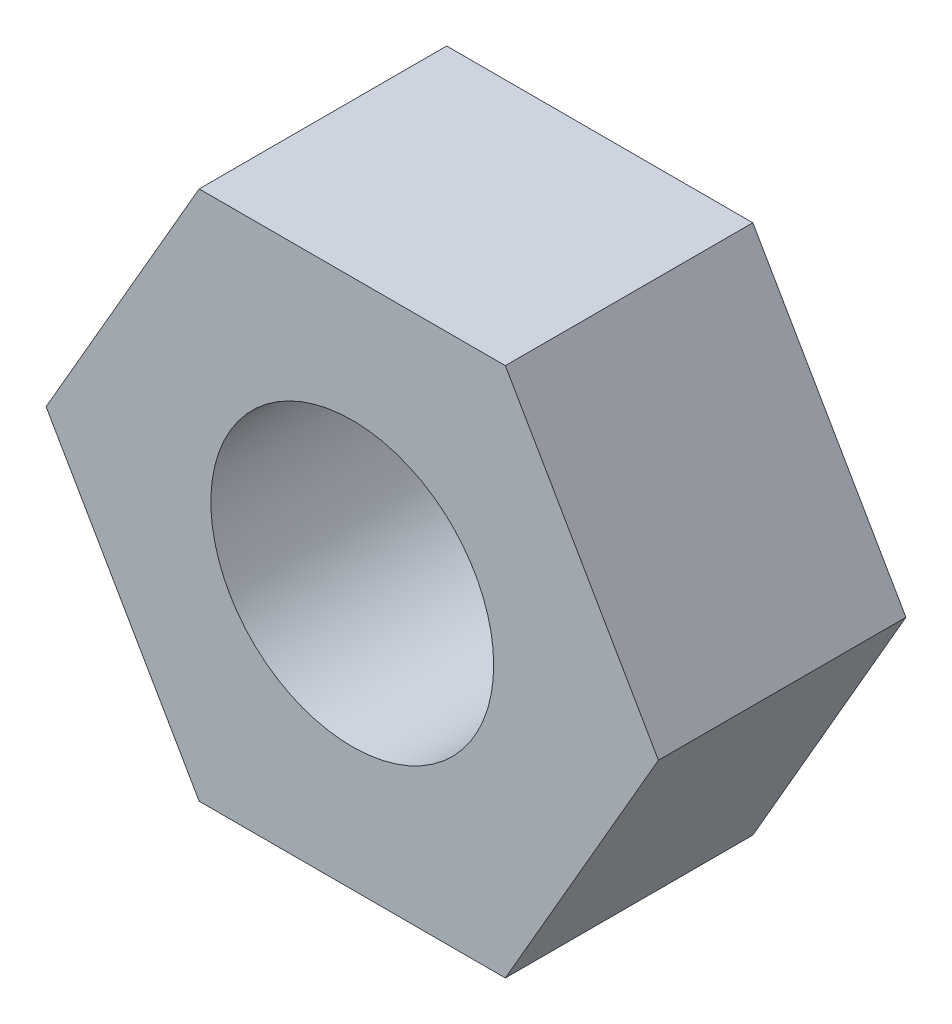
ISO-10303-21;
HEADER;
FILE_DESCRIPTION(('STEP AP214'),'2;1');
FILE_NAME('part.step','',(''),(''),'','','');
FILE_SCHEMA(('AUTOMOTIVE_DESIGN { 1 0 10303 214 1 1 1 1 }'));
ENDSEC;
DATA;
#1=APPLICATION_CONTEXT('core data for automotive mechanical design processes');
#2=APPLICATION_PROTOCOL_DEFINITION('international standard','automotive_design',2000,#1);
#3=PRODUCT_CONTEXT('',#1,'mechanical');
#4=PRODUCT('Part','Part','',(#3));
#5=PRODUCT_RELATED_PRODUCT_CATEGORY('part','',(#4));
#6=PRODUCT_DEFINITION_FORMATION('','',#4);
#7=PRODUCT_DEFINITION_CONTEXT('part definition',#1,'design');
#8=PRODUCT_DEFINITION('design','',#6,#7);
#9=PRODUCT_DEFINITION_SHAPE('','',#8);
#10=(LENGTH_UNIT() NAMED_UNIT(*) SI_UNIT(.MILLI.,.METRE.));
#11=(NAMED_UNIT(*) PLANE_ANGLE_UNIT() SI_UNIT($,.RADIAN.));
#12=(NAMED_UNIT(*) SI_UNIT($,.STERADIAN.) SOLID_ANGLE_UNIT());
#13=UNCERTAINTY_MEASURE_WITH_UNIT(LENGTH_MEASURE(1.E-05),#10,'distance_accuracy_value','');
#14=(GEOMETRIC_REPRESENTATION_CONTEXT(3) GLOBAL_UNCERTAINTY_ASSIGNED_CONTEXT((#13)) GLOBAL_UNIT_ASSIGNED_CONTEXT((#10,
#11,#12)) REPRESENTATION_CONTEXT('',''));
#15=CARTESIAN_POINT('',(0.,0.,0.));
#16=DIRECTION('',(0.,0.,1.));
#17=DIRECTION('',(1.,0.,0.));
#18=AXIS2_PLACEMENT_3D('',#15,#16,#17);
#19=CARTESIAN_POINT('',(0.,0.,7.));
#20=DIRECTION('',(0.,0.,1.));
#21=DIRECTION('',(1.,0.,0.));
#22=AXIS2_PLACEMENT_3D('',#19,#20,#21);
#23=PLANE('',#22);
#24=DIRECTION('',(0.5,-0.866025403784438,0.));
#25=VECTOR('',#24,1.);
#26=CARTESIAN_POINT('',(-8.66025403784439,0.,7.));
#27=LINE('',#26,#25);
#28=CARTESIAN_POINT('',(-8.66025403784439,0.,7.));
#29=VERTEX_POINT('',#28);
#30=CARTESIAN_POINT('',(-4.33012701892219,-7.5,7.));
#31=VERTEX_POINT('',#30);
#32=EDGE_CURVE('E129',#29,#31,#27,.T.);
#33=ORIENTED_EDGE('',*,*,#32,.T.);
#34=DIRECTION('',(1.,0.,0.));
#35=VECTOR('',#34,1.);
#36=CARTESIAN_POINT('',(-4.33012701892219,-7.5,7.));
#37=LINE('',#36,#35);
#38=CARTESIAN_POINT('',(4.33012701892219,-7.5,7.));
#39=VERTEX_POINT('',#38);
#40=EDGE_CURVE('E87',#31,#39,#37,.T.);
#41=ORIENTED_EDGE('',*,*,#40,.T.);
#42=DIRECTION('',(0.5,0.866025403784439,0.));
#43=VECTOR('',#42,1.);
#44=CARTESIAN_POINT('',(4.33012701892219,-7.5,7.));
#45=LINE('',#44,#43);
#46=CARTESIAN_POINT('',(8.66025403784439,0.,7.));
#47=VERTEX_POINT('',#46);
#48=EDGE_CURVE('E100',#39,#47,#45,.T.);
#49=ORIENTED_EDGE('',*,*,#48,.T.);
#50=DIRECTION('',(-0.5,0.866025403784438,0.));
#51=VECTOR('',#50,1.);
#52=CARTESIAN_POINT('',(8.66025403784439,0.,7.));
#53=LINE('',#52,#51);
#54=CARTESIAN_POINT('',(4.33012701892219,7.5,7.));
#55=VERTEX_POINT('',#54);
#56=EDGE_CURVE('E94',#47,#55,#53,.T.);
#57=ORIENTED_EDGE('',*,*,#56,.T.);
#58=DIRECTION('',(-1.,0.,0.));
#59=VECTOR('',#58,1.);
#60=CARTESIAN_POINT('',(4.33012701892219,7.5,7.));
#61=LINE('',#60,#59);
#62=CARTESIAN_POINT('',(-4.3301270189222,7.5,7.));
#63=VERTEX_POINT('',#62);
#64=EDGE_CURVE('E98',#55,#63,#61,.T.);
#65=ORIENTED_EDGE('',*,*,#64,.T.);
#66=DIRECTION('',(-0.5,-0.866025403784439,0.));
#67=VECTOR('',#66,1.);
#68=CARTESIAN_POINT('',(-4.3301270189222,7.5,7.));
#69=LINE('',#68,#67);
#70=EDGE_CURVE('E50',#63,#29,#69,.T.);
#71=ORIENTED_EDGE('',*,*,#70,.T.);
#72=EDGE_LOOP('',(#33,#41,#49,#57,#65,#71));
#73=FACE_BOUND('',#72,.T.);
#74=CARTESIAN_POINT('',(0.,0.,7.));
#75=DIRECTION('',(0.,0.,1.));
#76=DIRECTION('',(1.,0.,0.));
#77=AXIS2_PLACEMENT_3D('',#74,#75,#76);
#78=CIRCLE('',#77,4.);
#79=CARTESIAN_POINT('',(4.,0.,7.));
#80=VERTEX_POINT('',#79);
#81=EDGE_CURVE('E122',#80,#80,#78,.T.);
#82=ORIENTED_EDGE('',*,*,#81,.F.);
#83=EDGE_LOOP('',(#82));
#84=FACE_BOUND('',#83,.T.);
#85=ADVANCED_FACE('F33',(#73,#84),#23,.T.);
#86=CARTESIAN_POINT('',(0.,0.,0.));
#87=DIRECTION('',(0.,0.,1.));
#88=DIRECTION('',(1.,0.,0.));
#89=AXIS2_PLACEMENT_3D('',#86,#87,#88);
#90=PLANE('',#89);
#91=DIRECTION('',(0.5,-0.866025403784438,0.));
#92=VECTOR('',#91,1.);
#93=CARTESIAN_POINT('',(-8.66025403784439,0.,0.));
#94=LINE('',#93,#92);
#95=CARTESIAN_POINT('',(-8.66025403784439,0.,0.));
#96=VERTEX_POINT('',#95);
#97=CARTESIAN_POINT('',(-4.33012701892219,-7.5,0.));
#98=VERTEX_POINT('',#97);
#99=EDGE_CURVE('E118',#96,#98,#94,.T.);
#100=ORIENTED_EDGE('',*,*,#99,.F.);
#101=DIRECTION('',(-0.5,-0.866025403784439,0.));
#102=VECTOR('',#101,1.);
#103=CARTESIAN_POINT('',(-4.3301270189222,7.5,0.));
#104=LINE('',#103,#102);
#105=CARTESIAN_POINT('',(-4.3301270189222,7.5,0.));
#106=VERTEX_POINT('',#105);
#107=EDGE_CURVE('E79',#106,#96,#104,.T.);
#108=ORIENTED_EDGE('',*,*,#107,.F.);
#109=DIRECTION('',(-1.,0.,0.));
#110=VECTOR('',#109,1.);
#111=CARTESIAN_POINT('',(4.33012701892219,7.5,0.));
#112=LINE('',#111,#110);
#113=CARTESIAN_POINT('',(4.33012701892219,7.5,0.));
#114=VERTEX_POINT('',#113);
#115=EDGE_CURVE('E73',#114,#106,#112,.T.);
#116=ORIENTED_EDGE('',*,*,#115,.F.);
#117=DIRECTION('',(-0.5,0.866025403784438,0.));
#118=VECTOR('',#117,1.);
#119=CARTESIAN_POINT('',(8.66025403784439,0.,0.));
#120=LINE('',#119,#118);
#121=CARTESIAN_POINT('',(8.66025403784439,0.,0.));
#122=VERTEX_POINT('',#121);
#123=EDGE_CURVE('E108',#122,#114,#120,.T.);
#124=ORIENTED_EDGE('',*,*,#123,.F.);
#125=DIRECTION('',(0.5,0.866025403784439,0.));
#126=VECTOR('',#125,1.);
#127=CARTESIAN_POINT('',(4.33012701892219,-7.5,0.));
#128=LINE('',#127,#126);
#129=CARTESIAN_POINT('',(4.33012701892219,-7.5,0.));
#130=VERTEX_POINT('',#129);
#131=EDGE_CURVE('E124',#130,#122,#128,.T.);
#132=ORIENTED_EDGE('',*,*,#131,.F.);
#133=DIRECTION('',(1.,0.,0.));
#134=VECTOR('',#133,1.);
#135=CARTESIAN_POINT('',(-4.33012701892219,-7.5,0.));
#136=LINE('',#135,#134);
#137=EDGE_CURVE('E121',#98,#130,#136,.T.);
#138=ORIENTED_EDGE('',*,*,#137,.F.);
#139=EDGE_LOOP('',(#100,#108,#116,#124,#132,#138));
#140=FACE_BOUND('',#139,.T.);
#141=CARTESIAN_POINT('',(0.,0.,0.));
#142=DIRECTION('',(0.,0.,1.));
#143=DIRECTION('',(1.,0.,0.));
#144=AXIS2_PLACEMENT_3D('',#141,#142,#143);
#145=CIRCLE('',#144,4.);
#146=CARTESIAN_POINT('',(4.,0.,0.));
#147=VERTEX_POINT('',#146);
#148=EDGE_CURVE('E222',#147,#147,#145,.T.);
#149=ORIENTED_EDGE('',*,*,#148,.T.);
#150=EDGE_LOOP('',(#149));
#151=FACE_BOUND('',#150,.T.);
#152=ADVANCED_FACE('F138',(#140,#151),#90,.F.);
#153=CARTESIAN_POINT('',(-8.66025403784439,0.,7.));
#154=DIRECTION('',(0.866025403784438,0.5,0.));
#155=DIRECTION('',(-0.5,0.866025403784438,0.));
#156=AXIS2_PLACEMENT_3D('',#153,#154,#155);
#157=PLANE('',#156);
#158=ORIENTED_EDGE('',*,*,#99,.T.);
#159=DIRECTION('',(0.,0.,-1.));
#160=VECTOR('',#159,1.);
#161=CARTESIAN_POINT('',(-4.33012701892219,-7.5,7.));
#162=LINE('',#161,#160);
#163=EDGE_CURVE('E11',#31,#98,#162,.T.);
#164=ORIENTED_EDGE('',*,*,#163,.F.);
#165=ORIENTED_EDGE('',*,*,#32,.F.);
#166=DIRECTION('',(0.,0.,-1.));
#167=VECTOR('',#166,1.);
#168=CARTESIAN_POINT('',(-8.66025403784439,0.,7.));
#169=LINE('',#168,#167);
#170=EDGE_CURVE('E114',#29,#96,#169,.T.);
#171=ORIENTED_EDGE('',*,*,#170,.T.);
#172=EDGE_LOOP('',(#158,#164,#165,#171));
#173=FACE_BOUND('',#172,.T.);
#174=ADVANCED_FACE('F35',(#173),#157,.F.);
#175=CARTESIAN_POINT('',(-4.33012701892219,-7.5,7.));
#176=DIRECTION('',(0.,1.,0.));
#177=DIRECTION('',(0.,0.,1.));
#178=AXIS2_PLACEMENT_3D('',#175,#176,#177);
#179=PLANE('',#178);
#180=ORIENTED_EDGE('',*,*,#137,.T.);
#181=DIRECTION('',(0.,0.,-1.));
#182=VECTOR('',#181,1.);
#183=CARTESIAN_POINT('',(4.33012701892219,-7.5,7.));
#184=LINE('',#183,#182);
#185=EDGE_CURVE('E42',#39,#130,#184,.T.);
#186=ORIENTED_EDGE('',*,*,#185,.F.);
#187=ORIENTED_EDGE('',*,*,#40,.F.);
#188=ORIENTED_EDGE('',*,*,#163,.T.);
#189=EDGE_LOOP('',(#180,#186,#187,#188));
#190=FACE_BOUND('',#189,.T.);
#191=ADVANCED_FACE('F163',(#190),#179,.F.);
#192=CARTESIAN_POINT('',(4.33012701892219,-7.5,7.));
#193=DIRECTION('',(-0.866025403784439,0.5,0.));
#194=DIRECTION('',(-0.5,-0.866025403784439,0.));
#195=AXIS2_PLACEMENT_3D('',#192,#193,#194);
#196=PLANE('',#195);
#197=ORIENTED_EDGE('',*,*,#131,.T.);
#198=DIRECTION('',(0.,0.,-1.));
#199=VECTOR('',#198,1.);
#200=CARTESIAN_POINT('',(8.66025403784439,0.,7.));
#201=LINE('',#200,#199);
#202=EDGE_CURVE('E109',#47,#122,#201,.T.);
#203=ORIENTED_EDGE('',*,*,#202,.F.);
#204=ORIENTED_EDGE('',*,*,#48,.F.);
#205=ORIENTED_EDGE('',*,*,#185,.T.);
#206=EDGE_LOOP('',(#197,#203,#204,#205));
#207=FACE_BOUND('',#206,.T.);
#208=ADVANCED_FACE('F135',(#207),#196,.F.);
#209=CARTESIAN_POINT('',(8.66025403784439,0.,7.));
#210=DIRECTION('',(-0.866025403784438,-0.5,0.));
#211=DIRECTION('',(0.5,-0.866025403784439,0.));
#212=AXIS2_PLACEMENT_3D('',#209,#210,#211);
#213=PLANE('',#212);
#214=ORIENTED_EDGE('',*,*,#123,.T.);
#215=DIRECTION('',(0.,0.,-1.));
#216=VECTOR('',#215,1.);
#217=CARTESIAN_POINT('',(4.33012701892219,7.5,7.));
#218=LINE('',#217,#216);
#219=EDGE_CURVE('E105',#55,#114,#218,.T.);
#220=ORIENTED_EDGE('',*,*,#219,.F.);
#221=ORIENTED_EDGE('',*,*,#56,.F.);
#222=ORIENTED_EDGE('',*,*,#202,.T.);
#223=EDGE_LOOP('',(#214,#220,#221,#222));
#224=FACE_BOUND('',#223,.T.);
#225=ADVANCED_FACE('F106',(#224),#213,.F.);
#226=CARTESIAN_POINT('',(4.33012701892219,7.5,7.));
#227=DIRECTION('',(0.,-1.,0.));
#228=DIRECTION('',(1.,0.,0.));
#229=AXIS2_PLACEMENT_3D('',#226,#227,#228);
#230=PLANE('',#229);
#231=ORIENTED_EDGE('',*,*,#115,.T.);
#232=DIRECTION('',(0.,0.,-1.));
#233=VECTOR('',#232,1.);
#234=CARTESIAN_POINT('',(-4.3301270189222,7.5,7.));
#235=LINE('',#234,#233);
#236=EDGE_CURVE('E110',#63,#106,#235,.T.);
#237=ORIENTED_EDGE('',*,*,#236,.F.);
#238=ORIENTED_EDGE('',*,*,#64,.F.);
#239=ORIENTED_EDGE('',*,*,#219,.T.);
#240=EDGE_LOOP('',(#231,#237,#238,#239));
#241=FACE_BOUND('',#240,.T.);
#242=ADVANCED_FACE('F112',(#241),#230,.F.);
#243=CARTESIAN_POINT('',(-4.3301270189222,7.5,7.));
#244=DIRECTION('',(0.866025403784439,-0.5,0.));
#245=DIRECTION('',(0.5,0.866025403784439,0.));
#246=AXIS2_PLACEMENT_3D('',#243,#244,#245);
#247=PLANE('',#246);
#248=ORIENTED_EDGE('',*,*,#107,.T.);
#249=ORIENTED_EDGE('',*,*,#170,.F.);
#250=ORIENTED_EDGE('',*,*,#70,.F.);
#251=ORIENTED_EDGE('',*,*,#236,.T.);
#252=EDGE_LOOP('',(#248,#249,#250,#251));
#253=FACE_BOUND('',#252,.T.);
#254=ADVANCED_FACE('F143',(#253),#247,.F.);
#255=CARTESIAN_POINT('',(0.,0.,7.));
#256=DIRECTION('',(0.,0.,-1.));
#257=DIRECTION('',(-1.,0.,0.));
#258=AXIS2_PLACEMENT_3D('',#255,#256,#257);
#259=CYLINDRICAL_SURFACE('',#258,4.);
#260=ORIENTED_EDGE('',*,*,#81,.T.);
#261=EDGE_LOOP('',(#260));
#262=FACE_BOUND('',#261,.T.);
#263=ORIENTED_EDGE('',*,*,#148,.F.);
#264=EDGE_LOOP('',(#263));
#265=FACE_BOUND('',#264,.T.);
#266=ADVANCED_FACE('F145',(#262,#265),#259,.F.);
#267=CLOSED_SHELL('',(#85,#152,#174,#191,#208,#225,#242,#254,#266));
#268=MANIFOLD_SOLID_BREP('B2',#267);
#269=ADVANCED_BREP_SHAPE_REPRESENTATION('',(#18,#268),#14);
#270=SHAPE_DEFINITION_REPRESENTATION(#9,#269);
ENDSEC;
END-ISO-10303-21;
